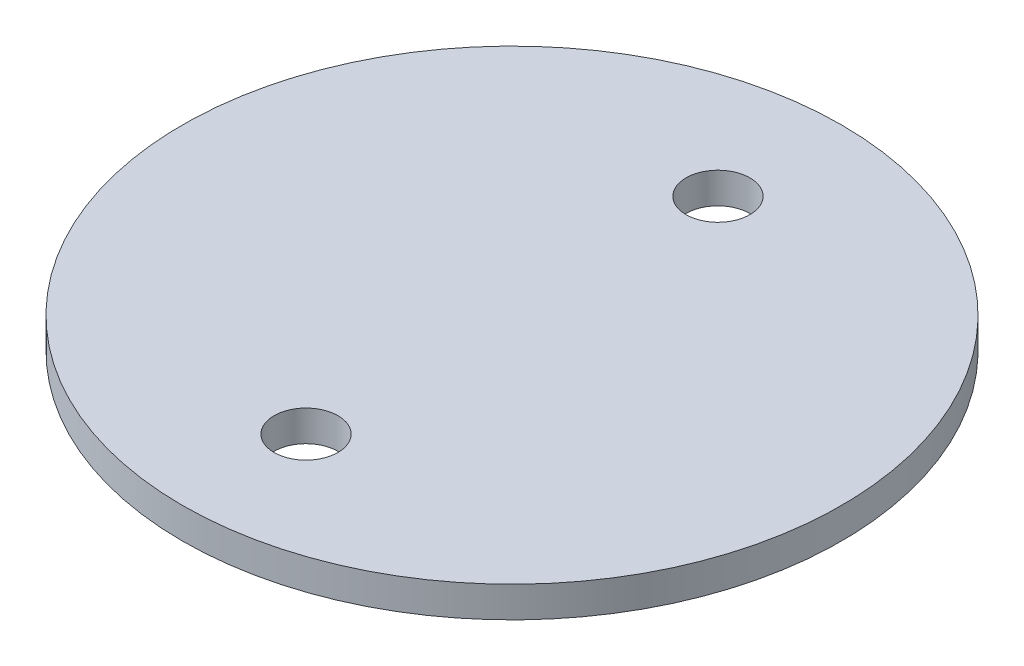
ISO-10303-21;
HEADER;
FILE_DESCRIPTION(('STEP AP214'),'2;1');
FILE_NAME('part.step','',(''),(''),'','','');
FILE_SCHEMA(('AUTOMOTIVE_DESIGN { 1 0 10303 214 1 1 1 1 }'));
ENDSEC;
DATA;
#1=APPLICATION_CONTEXT('core data for automotive mechanical design processes');
#2=APPLICATION_PROTOCOL_DEFINITION('international standard','automotive_design',2000,#1);
#3=PRODUCT_CONTEXT('',#1,'mechanical');
#4=PRODUCT('Part','Part','',(#3));
#5=PRODUCT_RELATED_PRODUCT_CATEGORY('part','',(#4));
#6=PRODUCT_DEFINITION_FORMATION('','',#4);
#7=PRODUCT_DEFINITION_CONTEXT('part definition',#1,'design');
#8=PRODUCT_DEFINITION('design','',#6,#7);
#9=PRODUCT_DEFINITION_SHAPE('','',#8);
#10=(LENGTH_UNIT() NAMED_UNIT(*) SI_UNIT(.MILLI.,.METRE.));
#11=(NAMED_UNIT(*) PLANE_ANGLE_UNIT() SI_UNIT($,.RADIAN.));
#12=(NAMED_UNIT(*) SI_UNIT($,.STERADIAN.) SOLID_ANGLE_UNIT());
#13=UNCERTAINTY_MEASURE_WITH_UNIT(LENGTH_MEASURE(1.E-05),#10,'distance_accuracy_value','');
#14=(GEOMETRIC_REPRESENTATION_CONTEXT(3) GLOBAL_UNCERTAINTY_ASSIGNED_CONTEXT((#13)) GLOBAL_UNIT_ASSIGNED_CONTEXT((#10,
#11,#12)) REPRESENTATION_CONTEXT('',''));
#15=CARTESIAN_POINT('',(0.,0.,0.));
#16=DIRECTION('',(0.,0.,1.));
#17=DIRECTION('',(1.,0.,0.));
#18=AXIS2_PLACEMENT_3D('',#15,#16,#17);
#19=CARTESIAN_POINT('',(0.,3.,20.));
#20=DIRECTION('',(0.,-1.,0.));
#21=DIRECTION('',(0.,0.,-1.));
#22=AXIS2_PLACEMENT_3D('',#19,#20,#21);
#23=CYLINDRICAL_SURFACE('',#22,3.1);
#24=CARTESIAN_POINT('',(0.,3.,20.));
#25=DIRECTION('',(0.,1.,0.));
#26=DIRECTION('',(0.,0.,1.));
#27=AXIS2_PLACEMENT_3D('',#24,#25,#26);
#28=CIRCLE('',#27,3.1);
#29=CARTESIAN_POINT('',(0.,3.,23.1));
#30=VERTEX_POINT('',#29);
#31=EDGE_CURVE('E47',#30,#30,#28,.T.);
#32=ORIENTED_EDGE('',*,*,#31,.T.);
#33=EDGE_LOOP('',(#32));
#34=FACE_BOUND('',#33,.T.);
#35=CARTESIAN_POINT('',(0.,0.,20.));
#36=DIRECTION('',(0.,1.,0.));
#37=DIRECTION('',(0.,0.,1.));
#38=AXIS2_PLACEMENT_3D('',#35,#36,#37);
#39=CIRCLE('',#38,3.1);
#40=CARTESIAN_POINT('',(0.,0.,23.1));
#41=VERTEX_POINT('',#40);
#42=EDGE_CURVE('E58',#41,#41,#39,.T.);
#43=ORIENTED_EDGE('',*,*,#42,.F.);
#44=EDGE_LOOP('',(#43));
#45=FACE_BOUND('',#44,.T.);
#46=ADVANCED_FACE('F39',(#34,#45),#23,.F.);
#47=CARTESIAN_POINT('',(0.,3.,-20.));
#48=DIRECTION('',(0.,-1.,0.));
#49=DIRECTION('',(0.,0.,-1.));
#50=AXIS2_PLACEMENT_3D('',#47,#48,#49);
#51=CYLINDRICAL_SURFACE('',#50,3.1);
#52=CARTESIAN_POINT('',(0.,3.,-20.));
#53=DIRECTION('',(0.,1.,0.));
#54=DIRECTION('',(0.,0.,1.));
#55=AXIS2_PLACEMENT_3D('',#52,#53,#54);
#56=CIRCLE('',#55,3.1);
#57=CARTESIAN_POINT('',(0.,3.,-16.9));
#58=VERTEX_POINT('',#57);
#59=EDGE_CURVE('E52',#58,#58,#56,.T.);
#60=ORIENTED_EDGE('',*,*,#59,.T.);
#61=EDGE_LOOP('',(#60));
#62=FACE_BOUND('',#61,.T.);
#63=CARTESIAN_POINT('',(0.,0.,-20.));
#64=DIRECTION('',(0.,1.,0.));
#65=DIRECTION('',(0.,0.,1.));
#66=AXIS2_PLACEMENT_3D('',#63,#64,#65);
#67=CIRCLE('',#66,3.1);
#68=CARTESIAN_POINT('',(0.,0.,-16.9));
#69=VERTEX_POINT('',#68);
#70=EDGE_CURVE('E56',#69,#69,#67,.T.);
#71=ORIENTED_EDGE('',*,*,#70,.F.);
#72=EDGE_LOOP('',(#71));
#73=FACE_BOUND('',#72,.T.);
#74=ADVANCED_FACE('F41',(#62,#73),#51,.F.);
#75=CARTESIAN_POINT('',(0.,3.,0.));
#76=DIRECTION('',(0.,-1.,0.));
#77=DIRECTION('',(0.,0.,-1.));
#78=AXIS2_PLACEMENT_3D('',#75,#76,#77);
#79=CYLINDRICAL_SURFACE('',#78,32.);
#80=CARTESIAN_POINT('',(0.,3.,0.));
#81=DIRECTION('',(0.,1.,0.));
#82=DIRECTION('',(0.,0.,1.));
#83=AXIS2_PLACEMENT_3D('',#80,#81,#82);
#84=CIRCLE('',#83,32.);
#85=CARTESIAN_POINT('',(0.,3.,32.));
#86=VERTEX_POINT('',#85);
#87=EDGE_CURVE('E10',#86,#86,#84,.T.);
#88=ORIENTED_EDGE('',*,*,#87,.F.);
#89=EDGE_LOOP('',(#88));
#90=FACE_BOUND('',#89,.T.);
#91=CARTESIAN_POINT('',(0.,0.,0.));
#92=DIRECTION('',(0.,1.,0.));
#93=DIRECTION('',(0.,0.,1.));
#94=AXIS2_PLACEMENT_3D('',#91,#92,#93);
#95=CIRCLE('',#94,32.);
#96=CARTESIAN_POINT('',(0.,0.,32.));
#97=VERTEX_POINT('',#96);
#98=EDGE_CURVE('E43',#97,#97,#95,.T.);
#99=ORIENTED_EDGE('',*,*,#98,.T.);
#100=EDGE_LOOP('',(#99));
#101=FACE_BOUND('',#100,.T.);
#102=ADVANCED_FACE('F74',(#90,#101),#79,.T.);
#103=CARTESIAN_POINT('',(0.,3.,0.));
#104=DIRECTION('',(0.,1.,0.));
#105=DIRECTION('',(0.,0.,1.));
#106=AXIS2_PLACEMENT_3D('',#103,#104,#105);
#107=PLANE('',#106);
#108=ORIENTED_EDGE('',*,*,#59,.F.);
#109=EDGE_LOOP('',(#108));
#110=FACE_BOUND('',#109,.T.);
#111=ORIENTED_EDGE('',*,*,#31,.F.);
#112=EDGE_LOOP('',(#111));
#113=FACE_BOUND('',#112,.T.);
#114=ORIENTED_EDGE('',*,*,#87,.T.);
#115=EDGE_LOOP('',(#114));
#116=FACE_BOUND('',#115,.T.);
#117=ADVANCED_FACE('F70',(#110,#113,#116),#107,.T.);
#118=CARTESIAN_POINT('',(0.,0.,0.));
#119=DIRECTION('',(0.,1.,0.));
#120=DIRECTION('',(0.,0.,1.));
#121=AXIS2_PLACEMENT_3D('',#118,#119,#120);
#122=PLANE('',#121);
#123=ORIENTED_EDGE('',*,*,#70,.T.);
#124=EDGE_LOOP('',(#123));
#125=FACE_BOUND('',#124,.T.);
#126=ORIENTED_EDGE('',*,*,#42,.T.);
#127=EDGE_LOOP('',(#126));
#128=FACE_BOUND('',#127,.T.);
#129=ORIENTED_EDGE('',*,*,#98,.F.);
#130=EDGE_LOOP('',(#129));
#131=FACE_BOUND('',#130,.T.);
#132=ADVANCED_FACE('F73',(#125,#128,#131),#122,.F.);
#133=CLOSED_SHELL('',(#46,#74,#102,#117,#132));
#134=MANIFOLD_SOLID_BREP('B2',#133);
#135=ADVANCED_BREP_SHAPE_REPRESENTATION('',(#18,#134),#14);
#136=SHAPE_DEFINITION_REPRESENTATION(#9,#135);
ENDSEC;
END-ISO-10303-21;
